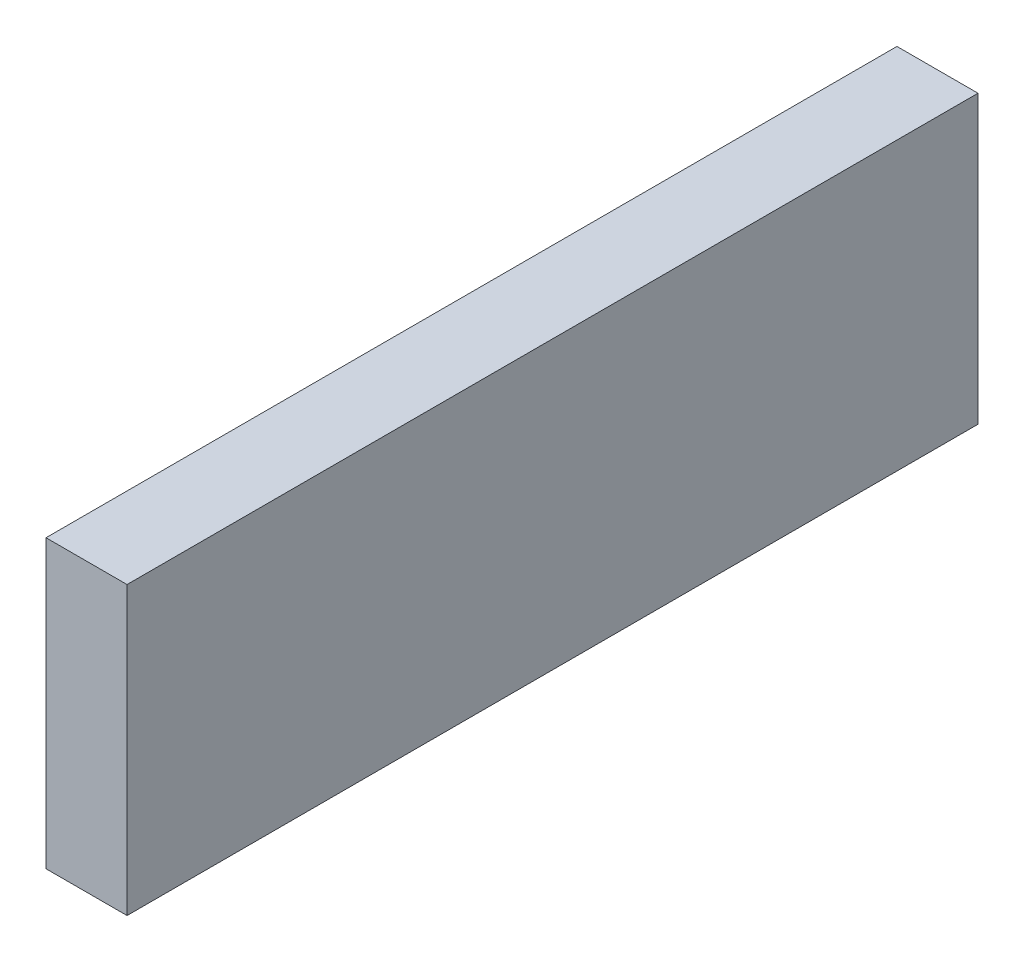
ISO-10303-21;
HEADER;
FILE_DESCRIPTION(('STEP AP214'),'2;1');
FILE_NAME('part.step','',(''),(''),'','','');
FILE_SCHEMA(('AUTOMOTIVE_DESIGN { 1 0 10303 214 1 1 1 1 }'));
ENDSEC;
DATA;
#1=APPLICATION_CONTEXT('core data for automotive mechanical design processes');
#2=APPLICATION_PROTOCOL_DEFINITION('international standard','automotive_design',2000,#1);
#3=PRODUCT_CONTEXT('',#1,'mechanical');
#4=PRODUCT('Part','Part','',(#3));
#5=PRODUCT_RELATED_PRODUCT_CATEGORY('part','',(#4));
#6=PRODUCT_DEFINITION_FORMATION('','',#4);
#7=PRODUCT_DEFINITION_CONTEXT('part definition',#1,'design');
#8=PRODUCT_DEFINITION('design','',#6,#7);
#9=PRODUCT_DEFINITION_SHAPE('','',#8);
#10=(LENGTH_UNIT() NAMED_UNIT(*) SI_UNIT(.MILLI.,.METRE.));
#11=(NAMED_UNIT(*) PLANE_ANGLE_UNIT() SI_UNIT($,.RADIAN.));
#12=(NAMED_UNIT(*) SI_UNIT($,.STERADIAN.) SOLID_ANGLE_UNIT());
#13=UNCERTAINTY_MEASURE_WITH_UNIT(LENGTH_MEASURE(1.E-05),#10,'distance_accuracy_value','');
#14=(GEOMETRIC_REPRESENTATION_CONTEXT(3) GLOBAL_UNCERTAINTY_ASSIGNED_CONTEXT((#13)) GLOBAL_UNIT_ASSIGNED_CONTEXT((#10,
#11,#12)) REPRESENTATION_CONTEXT('',''));
#15=CARTESIAN_POINT('',(0.,0.,0.));
#16=DIRECTION('',(0.,0.,1.));
#17=DIRECTION('',(1.,0.,0.));
#18=AXIS2_PLACEMENT_3D('',#15,#16,#17);
#19=CARTESIAN_POINT('',(4.,0.,0.));
#20=DIRECTION('',(0.,0.,-1.));
#21=DIRECTION('',(-1.,0.,0.));
#22=AXIS2_PLACEMENT_3D('',#19,#20,#21);
#23=PLANE('',#22);
#24=DIRECTION('',(0.,-1.,0.));
#25=VECTOR('',#24,1.);
#26=CARTESIAN_POINT('',(0.,0.,0.));
#27=LINE('',#26,#25);
#28=CARTESIAN_POINT('',(0.,14.15,0.));
#29=VERTEX_POINT('',#28);
#30=CARTESIAN_POINT('',(0.,0.,0.));
#31=VERTEX_POINT('',#30);
#32=EDGE_CURVE('E97',#29,#31,#27,.T.);
#33=ORIENTED_EDGE('',*,*,#32,.T.);
#34=DIRECTION('',(-1.,0.,0.));
#35=VECTOR('',#34,1.);
#36=CARTESIAN_POINT('',(4.,0.,0.));
#37=LINE('',#36,#35);
#38=CARTESIAN_POINT('',(4.,0.,0.));
#39=VERTEX_POINT('',#38);
#40=EDGE_CURVE('E11',#39,#31,#37,.T.);
#41=ORIENTED_EDGE('',*,*,#40,.F.);
#42=DIRECTION('',(0.,-1.,0.));
#43=VECTOR('',#42,1.);
#44=CARTESIAN_POINT('',(4.,0.,0.));
#45=LINE('',#44,#43);
#46=CARTESIAN_POINT('',(4.,14.15,0.));
#47=VERTEX_POINT('',#46);
#48=EDGE_CURVE('E85',#47,#39,#45,.T.);
#49=ORIENTED_EDGE('',*,*,#48,.F.);
#50=DIRECTION('',(-1.,0.,0.));
#51=VECTOR('',#50,1.);
#52=CARTESIAN_POINT('',(4.,14.15,0.));
#53=LINE('',#52,#51);
#54=EDGE_CURVE('E93',#47,#29,#53,.T.);
#55=ORIENTED_EDGE('',*,*,#54,.T.);
#56=EDGE_LOOP('',(#33,#41,#49,#55));
#57=FACE_BOUND('',#56,.T.);
#58=ADVANCED_FACE('F34',(#57),#23,.F.);
#59=CARTESIAN_POINT('',(4.,0.,0.));
#60=DIRECTION('',(0.,1.,0.));
#61=DIRECTION('',(0.,0.,1.));
#62=AXIS2_PLACEMENT_3D('',#59,#60,#61);
#63=PLANE('',#62);
#64=DIRECTION('',(0.,0.,-1.));
#65=VECTOR('',#64,1.);
#66=CARTESIAN_POINT('',(0.,0.,0.));
#67=LINE('',#66,#65);
#68=CARTESIAN_POINT('',(0.,0.,-42.));
#69=VERTEX_POINT('',#68);
#70=EDGE_CURVE('E89',#31,#69,#67,.T.);
#71=ORIENTED_EDGE('',*,*,#70,.T.);
#72=DIRECTION('',(-1.,0.,0.));
#73=VECTOR('',#72,1.);
#74=CARTESIAN_POINT('',(4.,0.,-42.));
#75=LINE('',#74,#73);
#76=CARTESIAN_POINT('',(4.,0.,-42.));
#77=VERTEX_POINT('',#76);
#78=EDGE_CURVE('E42',#77,#69,#75,.T.);
#79=ORIENTED_EDGE('',*,*,#78,.F.);
#80=DIRECTION('',(0.,0.,-1.));
#81=VECTOR('',#80,1.);
#82=CARTESIAN_POINT('',(4.,0.,0.));
#83=LINE('',#82,#81);
#84=EDGE_CURVE('E80',#39,#77,#83,.T.);
#85=ORIENTED_EDGE('',*,*,#84,.F.);
#86=ORIENTED_EDGE('',*,*,#40,.T.);
#87=EDGE_LOOP('',(#71,#79,#85,#86));
#88=FACE_BOUND('',#87,.T.);
#89=ADVANCED_FACE('F88',(#88),#63,.F.);
#90=CARTESIAN_POINT('',(4.,0.,-42.));
#91=DIRECTION('',(0.,0.,1.));
#92=DIRECTION('',(1.,0.,0.));
#93=AXIS2_PLACEMENT_3D('',#90,#91,#92);
#94=PLANE('',#93);
#95=DIRECTION('',(0.,1.,0.));
#96=VECTOR('',#95,1.);
#97=CARTESIAN_POINT('',(0.,0.,-42.));
#98=LINE('',#97,#96);
#99=CARTESIAN_POINT('',(0.,14.15,-42.));
#100=VERTEX_POINT('',#99);
#101=EDGE_CURVE('E67',#69,#100,#98,.T.);
#102=ORIENTED_EDGE('',*,*,#101,.T.);
#103=DIRECTION('',(-1.,0.,0.));
#104=VECTOR('',#103,1.);
#105=CARTESIAN_POINT('',(4.,14.15,-42.));
#106=LINE('',#105,#104);
#107=CARTESIAN_POINT('',(4.,14.15,-42.));
#108=VERTEX_POINT('',#107);
#109=EDGE_CURVE('E90',#108,#100,#106,.T.);
#110=ORIENTED_EDGE('',*,*,#109,.F.);
#111=DIRECTION('',(0.,1.,0.));
#112=VECTOR('',#111,1.);
#113=CARTESIAN_POINT('',(4.,0.,-42.));
#114=LINE('',#113,#112);
#115=EDGE_CURVE('E83',#77,#108,#114,.T.);
#116=ORIENTED_EDGE('',*,*,#115,.F.);
#117=ORIENTED_EDGE('',*,*,#78,.T.);
#118=EDGE_LOOP('',(#102,#110,#116,#117));
#119=FACE_BOUND('',#118,.T.);
#120=ADVANCED_FACE('F91',(#119),#94,.F.);
#121=CARTESIAN_POINT('',(4.,14.15,0.));
#122=DIRECTION('',(0.,-1.,0.));
#123=DIRECTION('',(0.,0.,-1.));
#124=AXIS2_PLACEMENT_3D('',#121,#122,#123);
#125=PLANE('',#124);
#126=DIRECTION('',(0.,0.,1.));
#127=VECTOR('',#126,1.);
#128=CARTESIAN_POINT('',(0.,14.15,0.));
#129=LINE('',#128,#127);
#130=EDGE_CURVE('E73',#100,#29,#129,.T.);
#131=ORIENTED_EDGE('',*,*,#130,.T.);
#132=ORIENTED_EDGE('',*,*,#54,.F.);
#133=DIRECTION('',(0.,0.,1.));
#134=VECTOR('',#133,1.);
#135=CARTESIAN_POINT('',(4.,14.15,0.));
#136=LINE('',#135,#134);
#137=EDGE_CURVE('E50',#108,#47,#136,.T.);
#138=ORIENTED_EDGE('',*,*,#137,.F.);
#139=ORIENTED_EDGE('',*,*,#109,.T.);
#140=EDGE_LOOP('',(#131,#132,#138,#139));
#141=FACE_BOUND('',#140,.T.);
#142=ADVANCED_FACE('F104',(#141),#125,.F.);
#143=CARTESIAN_POINT('',(4.,0.,0.));
#144=DIRECTION('',(-1.,0.,0.));
#145=DIRECTION('',(0.,0.,1.));
#146=AXIS2_PLACEMENT_3D('',#143,#144,#145);
#147=PLANE('',#146);
#148=ORIENTED_EDGE('',*,*,#48,.T.);
#149=ORIENTED_EDGE('',*,*,#84,.T.);
#150=ORIENTED_EDGE('',*,*,#115,.T.);
#151=ORIENTED_EDGE('',*,*,#137,.T.);
#152=EDGE_LOOP('',(#148,#149,#150,#151));
#153=FACE_BOUND('',#152,.T.);
#154=ADVANCED_FACE('F81',(#153),#147,.F.);
#155=CARTESIAN_POINT('',(0.,0.,0.));
#156=DIRECTION('',(-1.,0.,0.));
#157=DIRECTION('',(0.,0.,1.));
#158=AXIS2_PLACEMENT_3D('',#155,#156,#157);
#159=PLANE('',#158);
#160=ORIENTED_EDGE('',*,*,#32,.F.);
#161=ORIENTED_EDGE('',*,*,#130,.F.);
#162=ORIENTED_EDGE('',*,*,#101,.F.);
#163=ORIENTED_EDGE('',*,*,#70,.F.);
#164=EDGE_LOOP('',(#160,#161,#162,#163));
#165=FACE_BOUND('',#164,.T.);
#166=ADVANCED_FACE('F107',(#165),#159,.T.);
#167=CLOSED_SHELL('',(#58,#89,#120,#142,#154,#166));
#168=MANIFOLD_SOLID_BREP('B2',#167);
#169=ADVANCED_BREP_SHAPE_REPRESENTATION('',(#18,#168),#14);
#170=SHAPE_DEFINITION_REPRESENTATION(#9,#169);
ENDSEC;
END-ISO-10303-21;
